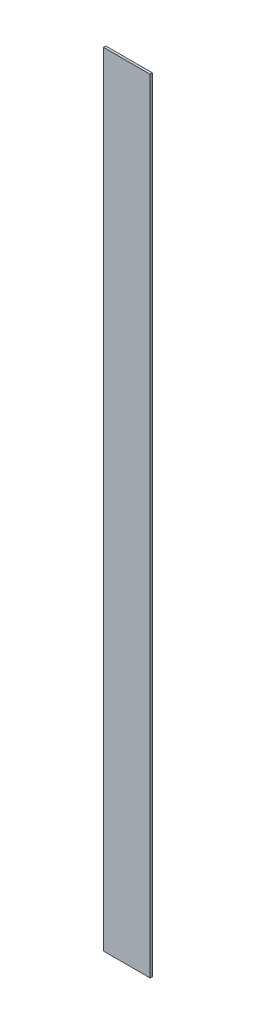
ISO-10303-21;
HEADER;
FILE_DESCRIPTION(('STEP AP214'),'2;1');
FILE_NAME('part.step','',(''),(''),'','','');
FILE_SCHEMA(('AUTOMOTIVE_DESIGN { 1 0 10303 214 1 1 1 1 }'));
ENDSEC;
DATA;
#1=APPLICATION_CONTEXT('core data for automotive mechanical design processes');
#2=APPLICATION_PROTOCOL_DEFINITION('international standard','automotive_design',2000,#1);
#3=PRODUCT_CONTEXT('',#1,'mechanical');
#4=PRODUCT('Part','Part','',(#3));
#5=PRODUCT_RELATED_PRODUCT_CATEGORY('part','',(#4));
#6=PRODUCT_DEFINITION_FORMATION('','',#4);
#7=PRODUCT_DEFINITION_CONTEXT('part definition',#1,'design');
#8=PRODUCT_DEFINITION('design','',#6,#7);
#9=PRODUCT_DEFINITION_SHAPE('','',#8);
#10=(LENGTH_UNIT() NAMED_UNIT(*) SI_UNIT(.MILLI.,.METRE.));
#11=(NAMED_UNIT(*) PLANE_ANGLE_UNIT() SI_UNIT($,.RADIAN.));
#12=(NAMED_UNIT(*) SI_UNIT($,.STERADIAN.) SOLID_ANGLE_UNIT());
#13=UNCERTAINTY_MEASURE_WITH_UNIT(LENGTH_MEASURE(1.E-05),#10,'distance_accuracy_value','');
#14=(GEOMETRIC_REPRESENTATION_CONTEXT(3) GLOBAL_UNCERTAINTY_ASSIGNED_CONTEXT((#13)) GLOBAL_UNIT_ASSIGNED_CONTEXT((#10,
#11,#12)) REPRESENTATION_CONTEXT('',''));
#15=CARTESIAN_POINT('',(0.,0.,0.));
#16=DIRECTION('',(0.,0.,1.));
#17=DIRECTION('',(1.,0.,0.));
#18=AXIS2_PLACEMENT_3D('',#15,#16,#17);
#19=CARTESIAN_POINT('',(2.5,84.,0.25400000000001));
#20=DIRECTION('',(0.,0.,-1.));
#21=DIRECTION('',(0.,1.,0.));
#22=AXIS2_PLACEMENT_3D('',#19,#20,#21);
#23=PLANE('',#22);
#24=DIRECTION('',(0.,-1.,0.));
#25=VECTOR('',#24,1.);
#26=CARTESIAN_POINT('',(-2.5,84.,0.25400000000001));
#27=LINE('',#26,#25);
#28=CARTESIAN_POINT('',(-2.5,84.,0.25400000000001));
#29=VERTEX_POINT('',#28);
#30=CARTESIAN_POINT('',(-2.5,0.,0.254));
#31=VERTEX_POINT('',#30);
#32=EDGE_CURVE('E102',#29,#31,#27,.T.);
#33=ORIENTED_EDGE('',*,*,#32,.T.);
#34=DIRECTION('',(-1.,0.,0.));
#35=VECTOR('',#34,1.);
#36=CARTESIAN_POINT('',(2.5,0.,0.254));
#37=LINE('',#36,#35);
#38=CARTESIAN_POINT('',(2.5,0.,0.254));
#39=VERTEX_POINT('',#38);
#40=EDGE_CURVE('E11',#39,#31,#37,.T.);
#41=ORIENTED_EDGE('',*,*,#40,.F.);
#42=DIRECTION('',(0.,-1.,0.));
#43=VECTOR('',#42,1.);
#44=CARTESIAN_POINT('',(2.5,84.,0.25400000000001));
#45=LINE('',#44,#43);
#46=CARTESIAN_POINT('',(2.5,84.,0.25400000000001));
#47=VERTEX_POINT('',#46);
#48=EDGE_CURVE('E90',#47,#39,#45,.T.);
#49=ORIENTED_EDGE('',*,*,#48,.F.);
#50=DIRECTION('',(-1.,0.,0.));
#51=VECTOR('',#50,1.);
#52=CARTESIAN_POINT('',(2.5,84.,0.25400000000001));
#53=LINE('',#52,#51);
#54=EDGE_CURVE('E98',#47,#29,#53,.T.);
#55=ORIENTED_EDGE('',*,*,#54,.T.);
#56=EDGE_LOOP('',(#33,#41,#49,#55));
#57=FACE_BOUND('',#56,.T.);
#58=ADVANCED_FACE('F39',(#57),#23,.F.);
#59=CARTESIAN_POINT('',(2.5,0.,0.254));
#60=DIRECTION('',(0.,1.,0.));
#61=DIRECTION('',(0.,0.,1.));
#62=AXIS2_PLACEMENT_3D('',#59,#60,#61);
#63=PLANE('',#62);
#64=DIRECTION('',(0.,0.,-1.));
#65=VECTOR('',#64,1.);
#66=CARTESIAN_POINT('',(-2.5,0.,0.254));
#67=LINE('',#66,#65);
#68=CARTESIAN_POINT('',(-2.5,0.,0.));
#69=VERTEX_POINT('',#68);
#70=EDGE_CURVE('E94',#31,#69,#67,.T.);
#71=ORIENTED_EDGE('',*,*,#70,.T.);
#72=DIRECTION('',(-1.,0.,0.));
#73=VECTOR('',#72,1.);
#74=CARTESIAN_POINT('',(2.5,0.,0.));
#75=LINE('',#74,#73);
#76=CARTESIAN_POINT('',(2.5,0.,0.));
#77=VERTEX_POINT('',#76);
#78=EDGE_CURVE('E47',#77,#69,#75,.T.);
#79=ORIENTED_EDGE('',*,*,#78,.F.);
#80=DIRECTION('',(0.,0.,-1.));
#81=VECTOR('',#80,1.);
#82=CARTESIAN_POINT('',(2.5,0.,0.254));
#83=LINE('',#82,#81);
#84=EDGE_CURVE('E85',#39,#77,#83,.T.);
#85=ORIENTED_EDGE('',*,*,#84,.F.);
#86=ORIENTED_EDGE('',*,*,#40,.T.);
#87=EDGE_LOOP('',(#71,#79,#85,#86));
#88=FACE_BOUND('',#87,.T.);
#89=ADVANCED_FACE('F93',(#88),#63,.F.);
#90=CARTESIAN_POINT('',(2.5,84.,0.));
#91=DIRECTION('',(0.,0.,1.));
#92=DIRECTION('',(0.,-1.,0.));
#93=AXIS2_PLACEMENT_3D('',#90,#91,#92);
#94=PLANE('',#93);
#95=DIRECTION('',(0.,1.,0.));
#96=VECTOR('',#95,1.);
#97=CARTESIAN_POINT('',(-2.5,84.,0.));
#98=LINE('',#97,#96);
#99=CARTESIAN_POINT('',(-2.5,84.,0.));
#100=VERTEX_POINT('',#99);
#101=EDGE_CURVE('E72',#69,#100,#98,.T.);
#102=ORIENTED_EDGE('',*,*,#101,.T.);
#103=DIRECTION('',(-1.,0.,0.));
#104=VECTOR('',#103,1.);
#105=CARTESIAN_POINT('',(2.5,84.,0.));
#106=LINE('',#105,#104);
#107=CARTESIAN_POINT('',(2.5,84.,0.));
#108=VERTEX_POINT('',#107);
#109=EDGE_CURVE('E95',#108,#100,#106,.T.);
#110=ORIENTED_EDGE('',*,*,#109,.F.);
#111=DIRECTION('',(0.,1.,0.));
#112=VECTOR('',#111,1.);
#113=CARTESIAN_POINT('',(2.5,84.,0.));
#114=LINE('',#113,#112);
#115=EDGE_CURVE('E88',#77,#108,#114,.T.);
#116=ORIENTED_EDGE('',*,*,#115,.F.);
#117=ORIENTED_EDGE('',*,*,#78,.T.);
#118=EDGE_LOOP('',(#102,#110,#116,#117));
#119=FACE_BOUND('',#118,.T.);
#120=ADVANCED_FACE('F96',(#119),#94,.F.);
#121=CARTESIAN_POINT('',(2.5,84.,0.25400000000001));
#122=DIRECTION('',(0.,-1.,0.));
#123=DIRECTION('',(0.,0.,-1.));
#124=AXIS2_PLACEMENT_3D('',#121,#122,#123);
#125=PLANE('',#124);
#126=DIRECTION('',(0.,0.,1.));
#127=VECTOR('',#126,1.);
#128=CARTESIAN_POINT('',(-2.5,84.,0.25400000000001));
#129=LINE('',#128,#127);
#130=EDGE_CURVE('E78',#100,#29,#129,.T.);
#131=ORIENTED_EDGE('',*,*,#130,.T.);
#132=ORIENTED_EDGE('',*,*,#54,.F.);
#133=DIRECTION('',(0.,0.,1.));
#134=VECTOR('',#133,1.);
#135=CARTESIAN_POINT('',(2.5,84.,0.25400000000001));
#136=LINE('',#135,#134);
#137=EDGE_CURVE('E55',#108,#47,#136,.T.);
#138=ORIENTED_EDGE('',*,*,#137,.F.);
#139=ORIENTED_EDGE('',*,*,#109,.T.);
#140=EDGE_LOOP('',(#131,#132,#138,#139));
#141=FACE_BOUND('',#140,.T.);
#142=ADVANCED_FACE('F109',(#141),#125,.F.);
#143=CARTESIAN_POINT('',(2.5,0.,0.));
#144=DIRECTION('',(1.,0.,0.));
#145=DIRECTION('',(0.,0.,-1.));
#146=AXIS2_PLACEMENT_3D('',#143,#144,#145);
#147=PLANE('',#146);
#148=ORIENTED_EDGE('',*,*,#48,.T.);
#149=ORIENTED_EDGE('',*,*,#84,.T.);
#150=ORIENTED_EDGE('',*,*,#115,.T.);
#151=ORIENTED_EDGE('',*,*,#137,.T.);
#152=EDGE_LOOP('',(#148,#149,#150,#151));
#153=FACE_BOUND('',#152,.T.);
#154=ADVANCED_FACE('F86',(#153),#147,.T.);
#155=CARTESIAN_POINT('',(-2.5,0.,0.));
#156=DIRECTION('',(1.,0.,0.));
#157=DIRECTION('',(0.,0.,-1.));
#158=AXIS2_PLACEMENT_3D('',#155,#156,#157);
#159=PLANE('',#158);
#160=ORIENTED_EDGE('',*,*,#32,.F.);
#161=ORIENTED_EDGE('',*,*,#130,.F.);
#162=ORIENTED_EDGE('',*,*,#101,.F.);
#163=ORIENTED_EDGE('',*,*,#70,.F.);
#164=EDGE_LOOP('',(#160,#161,#162,#163));
#165=FACE_BOUND('',#164,.T.);
#166=ADVANCED_FACE('F112',(#165),#159,.F.);
#167=CLOSED_SHELL('',(#58,#89,#120,#142,#154,#166));
#168=MANIFOLD_SOLID_BREP('B2',#167);
#169=ADVANCED_BREP_SHAPE_REPRESENTATION('',(#18,#168),#14);
#170=SHAPE_DEFINITION_REPRESENTATION(#9,#169);
ENDSEC;
END-ISO-10303-21;
